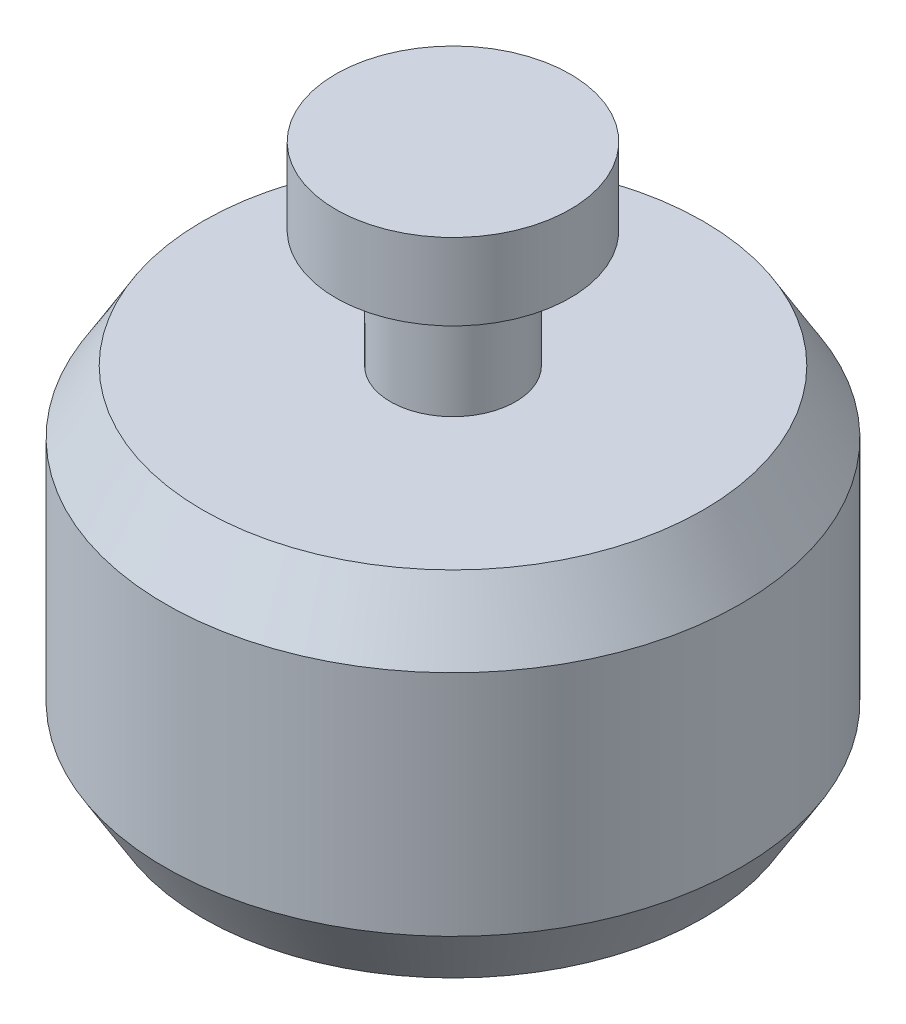
ISO-10303-21;
HEADER;
FILE_DESCRIPTION(('STEP AP214'),'2;1');
FILE_NAME('part.step','',(''),(''),'','','');
FILE_SCHEMA(('AUTOMOTIVE_DESIGN { 1 0 10303 214 1 1 1 1 }'));
ENDSEC;
DATA;
#1=APPLICATION_CONTEXT('core data for automotive mechanical design processes');
#2=APPLICATION_PROTOCOL_DEFINITION('international standard','automotive_design',2000,#1);
#3=PRODUCT_CONTEXT('',#1,'mechanical');
#4=PRODUCT('Part','Part','',(#3));
#5=PRODUCT_RELATED_PRODUCT_CATEGORY('part','',(#4));
#6=PRODUCT_DEFINITION_FORMATION('','',#4);
#7=PRODUCT_DEFINITION_CONTEXT('part definition',#1,'design');
#8=PRODUCT_DEFINITION('design','',#6,#7);
#9=PRODUCT_DEFINITION_SHAPE('','',#8);
#10=(LENGTH_UNIT() NAMED_UNIT(*) SI_UNIT(.MILLI.,.METRE.));
#11=(NAMED_UNIT(*) PLANE_ANGLE_UNIT() SI_UNIT($,.RADIAN.));
#12=(NAMED_UNIT(*) SI_UNIT($,.STERADIAN.) SOLID_ANGLE_UNIT());
#13=UNCERTAINTY_MEASURE_WITH_UNIT(LENGTH_MEASURE(1.E-05),#10,'distance_accuracy_value','');
#14=(GEOMETRIC_REPRESENTATION_CONTEXT(3) GLOBAL_UNCERTAINTY_ASSIGNED_CONTEXT((#13)) GLOBAL_UNIT_ASSIGNED_CONTEXT((#10,
#11,#12)) REPRESENTATION_CONTEXT('',''));
#15=CARTESIAN_POINT('',(0.,0.,0.));
#16=DIRECTION('',(0.,0.,1.));
#17=DIRECTION('',(1.,0.,0.));
#18=AXIS2_PLACEMENT_3D('',#15,#16,#17);
#19=CARTESIAN_POINT('',(0.,0.,0.));
#20=DIRECTION('',(0.,1.,0.));
#21=DIRECTION('',(-1.,0.,0.));
#22=AXIS2_PLACEMENT_3D('',#19,#20,#21);
#23=PLANE('',#22);
#24=CARTESIAN_POINT('',(0.,0.,0.));
#25=DIRECTION('',(0.,1.,0.));
#26=DIRECTION('',(-1.,0.,0.));
#27=AXIS2_PLACEMENT_3D('',#24,#25,#26);
#28=CIRCLE('',#27,10.16);
#29=CARTESIAN_POINT('',(-10.16,0.,0.));
#30=VERTEX_POINT('',#29);
#31=EDGE_CURVE('E10',#30,#30,#28,.T.);
#32=ORIENTED_EDGE('',*,*,#31,.F.);
#33=EDGE_LOOP('',(#32));
#34=FACE_BOUND('',#33,.T.);
#35=ADVANCED_FACE('F33',(#34),#23,.F.);
#36=CARTESIAN_POINT('',(0.,0.,0.));
#37=DIRECTION('',(0.,1.,0.));
#38=DIRECTION('',(-1.,0.,0.));
#39=AXIS2_PLACEMENT_3D('',#36,#37,#38);
#40=CONICAL_SURFACE('',#39,10.16,0.540419500270585);
#41=CARTESIAN_POINT('',(0.,2.54,0.));
#42=DIRECTION('',(0.,1.,0.));
#43=DIRECTION('',(-1.,0.,0.));
#44=AXIS2_PLACEMENT_3D('',#41,#42,#43);
#45=CIRCLE('',#44,11.684);
#46=CARTESIAN_POINT('',(-11.684,2.54,0.));
#47=VERTEX_POINT('',#46);
#48=EDGE_CURVE('E39',#47,#47,#45,.T.);
#49=ORIENTED_EDGE('',*,*,#48,.F.);
#50=EDGE_LOOP('',(#49));
#51=FACE_BOUND('',#50,.T.);
#52=ORIENTED_EDGE('',*,*,#31,.T.);
#53=EDGE_LOOP('',(#52));
#54=FACE_BOUND('',#53,.T.);
#55=ADVANCED_FACE('F99',(#51,#54),#40,.T.);
#56=CARTESIAN_POINT('',(0.,22.225,0.));
#57=DIRECTION('',(0.,1.,0.));
#58=DIRECTION('',(-1.,0.,0.));
#59=AXIS2_PLACEMENT_3D('',#56,#57,#58);
#60=CYLINDRICAL_SURFACE('',#59,11.684);
#61=CARTESIAN_POINT('',(0.,11.811,0.));
#62=DIRECTION('',(0.,1.,0.));
#63=DIRECTION('',(-1.,0.,0.));
#64=AXIS2_PLACEMENT_3D('',#61,#62,#63);
#65=CIRCLE('',#64,11.684);
#66=CARTESIAN_POINT('',(-11.684,11.811,0.));
#67=VERTEX_POINT('',#66);
#68=EDGE_CURVE('E43',#67,#67,#65,.T.);
#69=ORIENTED_EDGE('',*,*,#68,.F.);
#70=EDGE_LOOP('',(#69));
#71=FACE_BOUND('',#70,.T.);
#72=ORIENTED_EDGE('',*,*,#48,.T.);
#73=EDGE_LOOP('',(#72));
#74=FACE_BOUND('',#73,.T.);
#75=ADVANCED_FACE('F94',(#71,#74),#60,.T.);
#76=CARTESIAN_POINT('',(0.,11.811,0.));
#77=DIRECTION('',(0.,-1.,0.));
#78=DIRECTION('',(1.,0.,0.));
#79=AXIS2_PLACEMENT_3D('',#76,#77,#78);
#80=CONICAL_SURFACE('',#79,11.684,0.540419500270585);
#81=CARTESIAN_POINT('',(0.,14.351,0.));
#82=DIRECTION('',(0.,1.,0.));
#83=DIRECTION('',(-1.,0.,0.));
#84=AXIS2_PLACEMENT_3D('',#81,#82,#83);
#85=CIRCLE('',#84,10.16);
#86=CARTESIAN_POINT('',(-10.16,14.351,0.));
#87=VERTEX_POINT('',#86);
#88=EDGE_CURVE('E47',#87,#87,#85,.T.);
#89=ORIENTED_EDGE('',*,*,#88,.F.);
#90=EDGE_LOOP('',(#89));
#91=FACE_BOUND('',#90,.T.);
#92=ORIENTED_EDGE('',*,*,#68,.T.);
#93=EDGE_LOOP('',(#92));
#94=FACE_BOUND('',#93,.T.);
#95=ADVANCED_FACE('F88',(#91,#94),#80,.T.);
#96=CARTESIAN_POINT('',(10.16,14.351,0.));
#97=DIRECTION('',(0.,-1.,0.));
#98=DIRECTION('',(1.,0.,0.));
#99=AXIS2_PLACEMENT_3D('',#96,#97,#98);
#100=PLANE('',#99);
#101=CARTESIAN_POINT('',(0.,14.351,0.));
#102=DIRECTION('',(0.,1.,0.));
#103=DIRECTION('',(-1.,0.,0.));
#104=AXIS2_PLACEMENT_3D('',#101,#102,#103);
#105=CIRCLE('',#104,2.54);
#106=CARTESIAN_POINT('',(-2.54,14.351,0.));
#107=VERTEX_POINT('',#106);
#108=EDGE_CURVE('E52',#107,#107,#105,.T.);
#109=ORIENTED_EDGE('',*,*,#108,.F.);
#110=EDGE_LOOP('',(#109));
#111=FACE_BOUND('',#110,.T.);
#112=ORIENTED_EDGE('',*,*,#88,.T.);
#113=EDGE_LOOP('',(#112));
#114=FACE_BOUND('',#113,.T.);
#115=ADVANCED_FACE('F82',(#111,#114),#100,.F.);
#116=CARTESIAN_POINT('',(0.,22.225,0.));
#117=DIRECTION('',(0.,1.,0.));
#118=DIRECTION('',(-1.,0.,0.));
#119=AXIS2_PLACEMENT_3D('',#116,#117,#118);
#120=CYLINDRICAL_SURFACE('',#119,2.54);
#121=CARTESIAN_POINT('',(0.,19.1135,0.));
#122=DIRECTION('',(0.,1.,0.));
#123=DIRECTION('',(-1.,0.,0.));
#124=AXIS2_PLACEMENT_3D('',#121,#122,#123);
#125=CIRCLE('',#124,2.54);
#126=CARTESIAN_POINT('',(-2.54,19.1135,0.));
#127=VERTEX_POINT('',#126);
#128=EDGE_CURVE('E55',#127,#127,#125,.T.);
#129=ORIENTED_EDGE('',*,*,#128,.F.);
#130=EDGE_LOOP('',(#129));
#131=FACE_BOUND('',#130,.T.);
#132=ORIENTED_EDGE('',*,*,#108,.T.);
#133=EDGE_LOOP('',(#132));
#134=FACE_BOUND('',#133,.T.);
#135=ADVANCED_FACE('F76',(#131,#134),#120,.T.);
#136=CARTESIAN_POINT('',(2.54,19.1135,0.));
#137=DIRECTION('',(0.,1.,0.));
#138=DIRECTION('',(-1.,0.,0.));
#139=AXIS2_PLACEMENT_3D('',#136,#137,#138);
#140=PLANE('',#139);
#141=CARTESIAN_POINT('',(0.,19.1135,0.));
#142=DIRECTION('',(0.,1.,0.));
#143=DIRECTION('',(-1.,0.,0.));
#144=AXIS2_PLACEMENT_3D('',#141,#142,#143);
#145=CIRCLE('',#144,4.7625);
#146=CARTESIAN_POINT('',(-4.7625,19.1135,0.));
#147=VERTEX_POINT('',#146);
#148=EDGE_CURVE('E58',#147,#147,#145,.T.);
#149=ORIENTED_EDGE('',*,*,#148,.F.);
#150=EDGE_LOOP('',(#149));
#151=FACE_BOUND('',#150,.T.);
#152=ORIENTED_EDGE('',*,*,#128,.T.);
#153=EDGE_LOOP('',(#152));
#154=FACE_BOUND('',#153,.T.);
#155=ADVANCED_FACE('F70',(#151,#154),#140,.F.);
#156=CARTESIAN_POINT('',(0.,22.225,0.));
#157=DIRECTION('',(0.,1.,0.));
#158=DIRECTION('',(-1.,0.,0.));
#159=AXIS2_PLACEMENT_3D('',#156,#157,#158);
#160=CYLINDRICAL_SURFACE('',#159,4.7625);
#161=CARTESIAN_POINT('',(0.,22.225,0.));
#162=DIRECTION('',(0.,1.,0.));
#163=DIRECTION('',(-1.,0.,0.));
#164=AXIS2_PLACEMENT_3D('',#161,#162,#163);
#165=CIRCLE('',#164,4.7625);
#166=CARTESIAN_POINT('',(-4.7625,22.225,0.));
#167=VERTEX_POINT('',#166);
#168=EDGE_CURVE('E61',#167,#167,#165,.T.);
#169=ORIENTED_EDGE('',*,*,#168,.F.);
#170=EDGE_LOOP('',(#169));
#171=FACE_BOUND('',#170,.T.);
#172=ORIENTED_EDGE('',*,*,#148,.T.);
#173=EDGE_LOOP('',(#172));
#174=FACE_BOUND('',#173,.T.);
#175=ADVANCED_FACE('F67',(#171,#174),#160,.T.);
#176=CARTESIAN_POINT('',(4.7625,22.225,0.));
#177=DIRECTION('',(0.,-1.,0.));
#178=DIRECTION('',(1.,0.,0.));
#179=AXIS2_PLACEMENT_3D('',#176,#177,#178);
#180=PLANE('',#179);
#181=ORIENTED_EDGE('',*,*,#168,.T.);
#182=EDGE_LOOP('',(#181));
#183=FACE_BOUND('',#182,.T.);
#184=ADVANCED_FACE('F65',(#183),#180,.F.);
#185=CLOSED_SHELL('',(#35,#55,#75,#95,#115,#135,#155,#175,#184));
#186=MANIFOLD_SOLID_BREP('B2',#185);
#187=ADVANCED_BREP_SHAPE_REPRESENTATION('',(#18,#186),#14);
#188=SHAPE_DEFINITION_REPRESENTATION(#9,#187);
ENDSEC;
END-ISO-10303-21;
